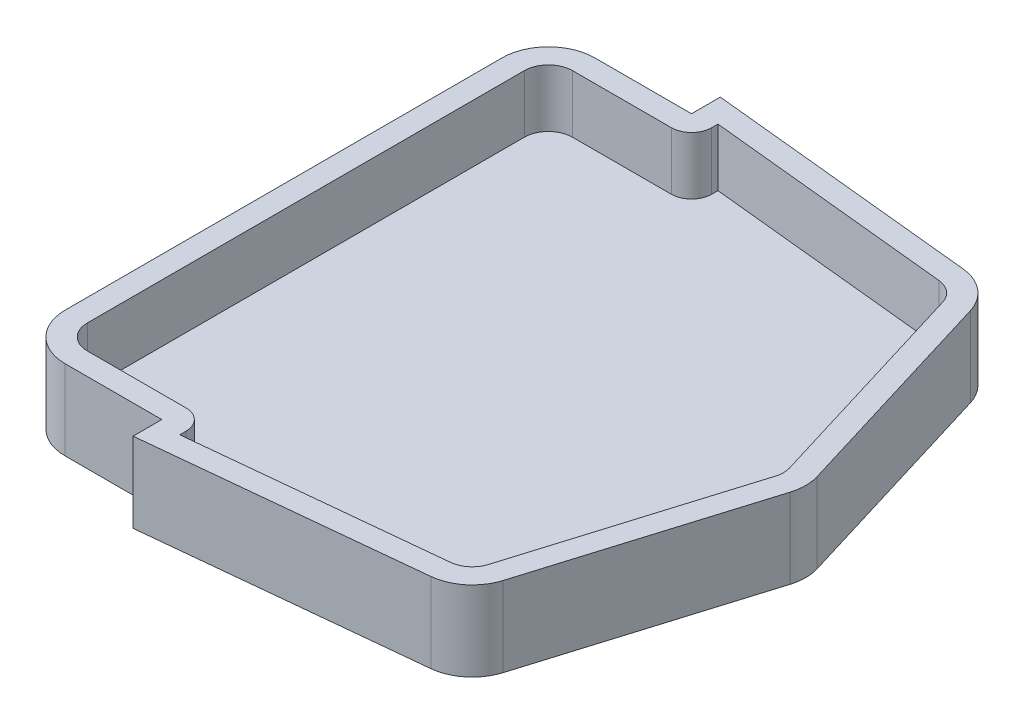
ISO-10303-21;
HEADER;
FILE_DESCRIPTION(('STEP AP214'),'2;1');
FILE_NAME('part.step','',(''),(''),'','','');
FILE_SCHEMA(('AUTOMOTIVE_DESIGN { 1 0 10303 214 1 1 1 1 }'));
ENDSEC;
DATA;
#1=APPLICATION_CONTEXT('core data for automotive mechanical design processes');
#2=APPLICATION_PROTOCOL_DEFINITION('international standard','automotive_design',2000,#1);
#3=PRODUCT_CONTEXT('',#1,'mechanical');
#4=PRODUCT('Part','Part','',(#3));
#5=PRODUCT_RELATED_PRODUCT_CATEGORY('part','',(#4));
#6=PRODUCT_DEFINITION_FORMATION('','',#4);
#7=PRODUCT_DEFINITION_CONTEXT('part definition',#1,'design');
#8=PRODUCT_DEFINITION('design','',#6,#7);
#9=PRODUCT_DEFINITION_SHAPE('','',#8);
#10=(LENGTH_UNIT() NAMED_UNIT(*) SI_UNIT(.MILLI.,.METRE.));
#11=(NAMED_UNIT(*) PLANE_ANGLE_UNIT() SI_UNIT($,.RADIAN.));
#12=(NAMED_UNIT(*) SI_UNIT($,.STERADIAN.) SOLID_ANGLE_UNIT());
#13=UNCERTAINTY_MEASURE_WITH_UNIT(LENGTH_MEASURE(1.E-05),#10,'distance_accuracy_value','');
#14=(GEOMETRIC_REPRESENTATION_CONTEXT(3) GLOBAL_UNCERTAINTY_ASSIGNED_CONTEXT((#13)) GLOBAL_UNIT_ASSIGNED_CONTEXT((#10,
#11,#12)) REPRESENTATION_CONTEXT('',''));
#15=CARTESIAN_POINT('',(0.,0.,0.));
#16=DIRECTION('',(0.,0.,1.));
#17=DIRECTION('',(1.,0.,0.));
#18=AXIS2_PLACEMENT_3D('',#15,#16,#17);
#19=CARTESIAN_POINT('',(-20.28,-2.2,0.));
#20=DIRECTION('',(1.,0.,0.));
#21=DIRECTION('',(0.,0.,-1.));
#22=AXIS2_PLACEMENT_3D('',#19,#20,#21);
#23=PLANE('',#22);
#24=DIRECTION('',(0.,1.,0.));
#25=VECTOR('',#24,1.);
#26=CARTESIAN_POINT('',(-20.28,-2.2,19.7));
#27=LINE('',#26,#25);
#28=CARTESIAN_POINT('',(-20.28,-4.2,19.7));
#29=VERTEX_POINT('',#28);
#30=CARTESIAN_POINT('',(-20.28,3.,19.7));
#31=VERTEX_POINT('',#30);
#32=EDGE_CURVE('E63',#29,#31,#27,.T.);
#33=ORIENTED_EDGE('',*,*,#32,.T.);
#34=DIRECTION('',(0.,0.,-1.));
#35=VECTOR('',#34,1.);
#36=CARTESIAN_POINT('',(-20.28,3.,0.));
#37=LINE('',#36,#35);
#38=CARTESIAN_POINT('',(-20.28,3.,-19.7));
#39=VERTEX_POINT('',#38);
#40=EDGE_CURVE('E337',#31,#39,#37,.T.);
#41=ORIENTED_EDGE('',*,*,#40,.T.);
#42=DIRECTION('',(0.,1.,0.));
#43=VECTOR('',#42,1.);
#44=CARTESIAN_POINT('',(-20.28,-2.2,-19.7));
#45=LINE('',#44,#43);
#46=CARTESIAN_POINT('',(-20.28,-4.2,-19.7));
#47=VERTEX_POINT('',#46);
#48=EDGE_CURVE('E11',#47,#39,#45,.T.);
#49=ORIENTED_EDGE('',*,*,#48,.F.);
#50=DIRECTION('',(0.,0.,-1.));
#51=VECTOR('',#50,1.);
#52=CARTESIAN_POINT('',(-20.28,-4.2,19.7));
#53=LINE('',#52,#51);
#54=EDGE_CURVE('E245',#29,#47,#53,.T.);
#55=ORIENTED_EDGE('',*,*,#54,.F.);
#56=EDGE_LOOP('',(#33,#41,#49,#55));
#57=FACE_BOUND('',#56,.T.);
#58=ADVANCED_FACE('F38',(#57),#23,.F.);
#59=CARTESIAN_POINT('',(-16.1,-2.2,-19.7));
#60=DIRECTION('',(0.,1.,0.));
#61=DIRECTION('',(0.,0.,1.));
#62=AXIS2_PLACEMENT_3D('',#59,#60,#61);
#63=CYLINDRICAL_SURFACE('',#62,4.18);
#64=ORIENTED_EDGE('',*,*,#48,.T.);
#65=CARTESIAN_POINT('',(-16.1,3.,-19.7));
#66=DIRECTION('',(0.,-1.,0.));
#67=DIRECTION('',(0.,0.,-1.));
#68=AXIS2_PLACEMENT_3D('',#65,#66,#67);
#69=CIRCLE('',#68,4.18);
#70=CARTESIAN_POINT('',(-16.1,3.,-23.88));
#71=VERTEX_POINT('',#70);
#72=EDGE_CURVE('E339',#39,#71,#69,.T.);
#73=ORIENTED_EDGE('',*,*,#72,.T.);
#74=DIRECTION('',(0.,1.,0.));
#75=VECTOR('',#74,1.);
#76=CARTESIAN_POINT('',(-16.1,-2.2,-23.88));
#77=LINE('',#76,#75);
#78=CARTESIAN_POINT('',(-16.1,-4.2,-23.88));
#79=VERTEX_POINT('',#78);
#80=EDGE_CURVE('E47',#79,#71,#77,.T.);
#81=ORIENTED_EDGE('',*,*,#80,.F.);
#82=CARTESIAN_POINT('',(-16.1,-4.2,-19.7));
#83=DIRECTION('',(0.,-1.,0.));
#84=DIRECTION('',(0.,0.,-1.));
#85=AXIS2_PLACEMENT_3D('',#82,#83,#84);
#86=CIRCLE('',#85,4.18);
#87=EDGE_CURVE('E249',#47,#79,#86,.T.);
#88=ORIENTED_EDGE('',*,*,#87,.F.);
#89=EDGE_LOOP('',(#64,#73,#81,#88));
#90=FACE_BOUND('',#89,.T.);
#91=ADVANCED_FACE('F548',(#90),#63,.T.);
#92=CARTESIAN_POINT('',(0.,-2.2,-23.88));
#93=DIRECTION('',(0.,0.,1.));
#94=DIRECTION('',(1.,0.,0.));
#95=AXIS2_PLACEMENT_3D('',#92,#93,#94);
#96=PLANE('',#95);
#97=ORIENTED_EDGE('',*,*,#80,.T.);
#98=DIRECTION('',(1.,0.,0.));
#99=VECTOR('',#98,1.);
#100=CARTESIAN_POINT('',(0.,3.,-23.88));
#101=LINE('',#100,#99);
#102=CARTESIAN_POINT('',(-7.38,3.,-23.88));
#103=VERTEX_POINT('',#102);
#104=EDGE_CURVE('E342',#71,#103,#101,.T.);
#105=ORIENTED_EDGE('',*,*,#104,.T.);
#106=DIRECTION('',(0.,1.,0.));
#107=VECTOR('',#106,1.);
#108=CARTESIAN_POINT('',(-7.38,-2.2,-23.88));
#109=LINE('',#108,#107);
#110=CARTESIAN_POINT('',(-7.38,-4.2,-23.88));
#111=VERTEX_POINT('',#110);
#112=EDGE_CURVE('E440',#111,#103,#109,.T.);
#113=ORIENTED_EDGE('',*,*,#112,.F.);
#114=DIRECTION('',(1.,0.,0.));
#115=VECTOR('',#114,1.);
#116=CARTESIAN_POINT('',(-16.1,-4.2,-23.88));
#117=LINE('',#116,#115);
#118=EDGE_CURVE('E259',#79,#111,#117,.T.);
#119=ORIENTED_EDGE('',*,*,#118,.F.);
#120=EDGE_LOOP('',(#97,#105,#113,#119));
#121=FACE_BOUND('',#120,.T.);
#122=ADVANCED_FACE('F555',(#121),#96,.F.);
#123=CARTESIAN_POINT('',(-7.38,-2.2,0.));
#124=DIRECTION('',(1.,0.,0.));
#125=DIRECTION('',(0.,0.,-1.));
#126=AXIS2_PLACEMENT_3D('',#123,#124,#125);
#127=PLANE('',#126);
#128=ORIENTED_EDGE('',*,*,#112,.T.);
#129=DIRECTION('',(0.,0.,-1.));
#130=VECTOR('',#129,1.);
#131=CARTESIAN_POINT('',(-7.38,3.,0.));
#132=LINE('',#131,#130);
#133=CARTESIAN_POINT('',(-7.38,3.,-26.4744016789471));
#134=VERTEX_POINT('',#133);
#135=EDGE_CURVE('E345',#103,#134,#132,.T.);
#136=ORIENTED_EDGE('',*,*,#135,.T.);
#137=DIRECTION('',(0.,1.,0.));
#138=VECTOR('',#137,1.);
#139=CARTESIAN_POINT('',(-7.38,-2.2,-26.4744016789471));
#140=LINE('',#139,#138);
#141=CARTESIAN_POINT('',(-7.38,-4.2,-26.4744016789471));
#142=VERTEX_POINT('',#141);
#143=EDGE_CURVE('E438',#142,#134,#140,.T.);
#144=ORIENTED_EDGE('',*,*,#143,.F.);
#145=DIRECTION('',(0.,0.,-1.));
#146=VECTOR('',#145,1.);
#147=CARTESIAN_POINT('',(-7.38,-4.2,-23.88));
#148=LINE('',#147,#146);
#149=EDGE_CURVE('E262',#111,#142,#148,.T.);
#150=ORIENTED_EDGE('',*,*,#149,.F.);
#151=EDGE_LOOP('',(#128,#136,#144,#150));
#152=FACE_BOUND('',#151,.T.);
#153=ADVANCED_FACE('F636',(#152),#127,.F.);
#154=CARTESIAN_POINT('',(2.58165178947084,-2.2,-25.4644642248835));
#155=DIRECTION('',(-0.100865485691314,0.,0.994900072266685));
#156=DIRECTION('',(0.994900072266685,0.,0.100865485691314));
#157=AXIS2_PLACEMENT_3D('',#154,#155,#156);
#158=PLANE('',#157);
#159=ORIENTED_EDGE('',*,*,#143,.T.);
#160=DIRECTION('',(0.994900072266685,0.,0.100865485691314));
#161=VECTOR('',#160,1.);
#162=CARTESIAN_POINT('',(2.58165178947084,3.,-25.4644642248835));
#163=LINE('',#162,#161);
#164=CARTESIAN_POINT('',(16.9959519590122,3.,-24.0031060161252));
#165=VERTEX_POINT('',#164);
#166=EDGE_CURVE('E348',#134,#165,#163,.T.);
#167=ORIENTED_EDGE('',*,*,#166,.T.);
#168=DIRECTION('',(0.,1.,0.));
#169=VECTOR('',#168,1.);
#170=CARTESIAN_POINT('',(16.9959519590122,-2.2,-24.0031060161252));
#171=LINE('',#170,#169);
#172=CARTESIAN_POINT('',(16.9959519590122,-4.2,-24.0031060161252));
#173=VERTEX_POINT('',#172);
#174=EDGE_CURVE('E436',#173,#165,#171,.T.);
#175=ORIENTED_EDGE('',*,*,#174,.F.);
#176=DIRECTION('',(0.994900072266685,0.,0.100865485691314));
#177=VECTOR('',#176,1.);
#178=CARTESIAN_POINT('',(-7.38,-4.2,-26.4744016789471));
#179=LINE('',#178,#177);
#180=EDGE_CURVE('E265',#142,#173,#179,.T.);
#181=ORIENTED_EDGE('',*,*,#180,.F.);
#182=EDGE_LOOP('',(#159,#167,#175,#181));
#183=FACE_BOUND('',#182,.T.);
#184=ADVANCED_FACE('F632',(#183),#158,.F.);
#185=CARTESIAN_POINT('',(16.5743342288224,-2.2,-19.8444237140504));
#186=DIRECTION('',(0.,1.,0.));
#187=DIRECTION('',(0.,0.,1.));
#188=AXIS2_PLACEMENT_3D('',#185,#186,#187);
#189=CYLINDRICAL_SURFACE('',#188,4.18);
#190=ORIENTED_EDGE('',*,*,#174,.T.);
#191=CARTESIAN_POINT('',(16.5743342288224,3.,-19.8444237140504));
#192=DIRECTION('',(0.,-1.,0.));
#193=DIRECTION('',(0.,0.,-1.));
#194=AXIS2_PLACEMENT_3D('',#191,#192,#193);
#195=CIRCLE('',#194,4.18);
#196=CARTESIAN_POINT('',(20.5730821232284,3.,-21.0619684881692));
#197=VERTEX_POINT('',#196);
#198=EDGE_CURVE('E351',#165,#197,#195,.T.);
#199=ORIENTED_EDGE('',*,*,#198,.T.);
#200=DIRECTION('',(0.,1.,0.));
#201=VECTOR('',#200,1.);
#202=CARTESIAN_POINT('',(20.5730821232284,-2.2,-21.0619684881692));
#203=LINE('',#202,#201);
#204=CARTESIAN_POINT('',(20.5730821232284,-4.2,-21.0619684881692));
#205=VERTEX_POINT('',#204);
#206=EDGE_CURVE('E434',#205,#197,#203,.T.);
#207=ORIENTED_EDGE('',*,*,#206,.F.);
#208=CARTESIAN_POINT('',(16.5743342288224,-4.2,-19.8444237140504));
#209=DIRECTION('',(0.,-1.,0.));
#210=DIRECTION('',(0.,0.,-1.));
#211=AXIS2_PLACEMENT_3D('',#208,#209,#210);
#212=CIRCLE('',#211,4.18000000000001);
#213=EDGE_CURVE('E268',#173,#205,#212,.T.);
#214=ORIENTED_EDGE('',*,*,#213,.F.);
#215=EDGE_LOOP('',(#190,#199,#207,#214));
#216=FACE_BOUND('',#215,.T.);
#217=ADVANCED_FACE('F628',(#216),#189,.T.);
#218=CARTESIAN_POINT('',(24.6964766523071,-2.2,-7.51962036147032));
#219=DIRECTION('',(-0.956638252250232,0.,0.291278654095389));
#220=DIRECTION('',(0.291278654095389,0.,0.956638252250232));
#221=AXIS2_PLACEMENT_3D('',#218,#219,#220);
#222=PLANE('',#221);
#223=ORIENTED_EDGE('',*,*,#206,.T.);
#224=DIRECTION('',(0.291278654095389,0.,0.956638252250232));
#225=VECTOR('',#224,1.);
#226=CARTESIAN_POINT('',(24.6964766523071,3.,-7.51962036147032));
#227=LINE('',#226,#225);
#228=CARTESIAN_POINT('',(26.61534210722,3.,-1.21754477411871));
#229=VERTEX_POINT('',#228);
#230=EDGE_CURVE('E354',#197,#229,#227,.T.);
#231=ORIENTED_EDGE('',*,*,#230,.T.);
#232=DIRECTION('',(0.,1.,0.));
#233=VECTOR('',#232,1.);
#234=CARTESIAN_POINT('',(26.61534210722,-2.2,-1.21754477411871));
#235=LINE('',#234,#233);
#236=CARTESIAN_POINT('',(26.61534210722,-4.2,-1.21754477411871));
#237=VERTEX_POINT('',#236);
#238=EDGE_CURVE('E432',#237,#229,#235,.T.);
#239=ORIENTED_EDGE('',*,*,#238,.F.);
#240=DIRECTION('',(0.291278654095389,0.,0.956638252250232));
#241=VECTOR('',#240,1.);
#242=CARTESIAN_POINT('',(20.5730821232284,-4.2,-21.0619684881692));
#243=LINE('',#242,#241);
#244=EDGE_CURVE('E271',#205,#237,#243,.T.);
#245=ORIENTED_EDGE('',*,*,#244,.F.);
#246=EDGE_LOOP('',(#223,#231,#239,#245));
#247=FACE_BOUND('',#246,.T.);
#248=ADVANCED_FACE('F624',(#247),#222,.F.);
#249=CARTESIAN_POINT('',(22.616594212814,-2.2,0.));
#250=DIRECTION('',(0.,1.,0.));
#251=DIRECTION('',(0.,0.,1.));
#252=AXIS2_PLACEMENT_3D('',#249,#250,#251);
#253=CYLINDRICAL_SURFACE('',#252,4.18);
#254=ORIENTED_EDGE('',*,*,#238,.T.);
#255=CARTESIAN_POINT('',(22.616594212814,3.,0.));
#256=DIRECTION('',(0.,-1.,0.));
#257=DIRECTION('',(0.,0.,-1.));
#258=AXIS2_PLACEMENT_3D('',#255,#256,#257);
#259=CIRCLE('',#258,4.18);
#260=CARTESIAN_POINT('',(26.61534210722,3.,1.21754477411873));
#261=VERTEX_POINT('',#260);
#262=EDGE_CURVE('E357',#229,#261,#259,.T.);
#263=ORIENTED_EDGE('',*,*,#262,.T.);
#264=DIRECTION('',(0.,1.,0.));
#265=VECTOR('',#264,1.);
#266=CARTESIAN_POINT('',(26.61534210722,-2.2,1.21754477411873));
#267=LINE('',#266,#265);
#268=CARTESIAN_POINT('',(26.61534210722,-4.2,1.21754477411873));
#269=VERTEX_POINT('',#268);
#270=EDGE_CURVE('E430',#269,#261,#267,.T.);
#271=ORIENTED_EDGE('',*,*,#270,.F.);
#272=CARTESIAN_POINT('',(22.616594212814,-4.2,0.));
#273=DIRECTION('',(0.,-1.,0.));
#274=DIRECTION('',(0.,0.,-1.));
#275=AXIS2_PLACEMENT_3D('',#272,#273,#274);
#276=CIRCLE('',#275,4.17999999999999);
#277=EDGE_CURVE('E274',#237,#269,#276,.T.);
#278=ORIENTED_EDGE('',*,*,#277,.F.);
#279=EDGE_LOOP('',(#254,#263,#271,#278));
#280=FACE_BOUND('',#279,.T.);
#281=ADVANCED_FACE('F620',(#280),#253,.T.);
#282=CARTESIAN_POINT('',(24.6964766523072,-2.2,7.51962036147032));
#283=DIRECTION('',(-0.956638252250232,0.,-0.291278654095389));
#284=DIRECTION('',(-0.291278654095389,0.,0.956638252250232));
#285=AXIS2_PLACEMENT_3D('',#282,#283,#284);
#286=PLANE('',#285);
#287=ORIENTED_EDGE('',*,*,#270,.T.);
#288=DIRECTION('',(-0.291278654095389,0.,0.956638252250232));
#289=VECTOR('',#288,1.);
#290=CARTESIAN_POINT('',(24.6964766523072,3.,7.51962036147032));
#291=LINE('',#290,#289);
#292=CARTESIAN_POINT('',(20.5730821232284,3.,21.0619684881692));
#293=VERTEX_POINT('',#292);
#294=EDGE_CURVE('E360',#261,#293,#291,.T.);
#295=ORIENTED_EDGE('',*,*,#294,.T.);
#296=DIRECTION('',(0.,1.,0.));
#297=VECTOR('',#296,1.);
#298=CARTESIAN_POINT('',(20.5730821232284,-2.2,21.0619684881692));
#299=LINE('',#298,#297);
#300=CARTESIAN_POINT('',(20.5730821232284,-4.2,21.0619684881692));
#301=VERTEX_POINT('',#300);
#302=EDGE_CURVE('E428',#301,#293,#299,.T.);
#303=ORIENTED_EDGE('',*,*,#302,.F.);
#304=DIRECTION('',(-0.291278654095389,0.,0.956638252250232));
#305=VECTOR('',#304,1.);
#306=CARTESIAN_POINT('',(26.61534210722,-4.2,1.21754477411873));
#307=LINE('',#306,#305);
#308=EDGE_CURVE('E277',#269,#301,#307,.T.);
#309=ORIENTED_EDGE('',*,*,#308,.F.);
#310=EDGE_LOOP('',(#287,#295,#303,#309));
#311=FACE_BOUND('',#310,.T.);
#312=ADVANCED_FACE('F616',(#311),#286,.F.);
#313=CARTESIAN_POINT('',(16.5743342288225,-2.2,19.8444237140504));
#314=DIRECTION('',(0.,1.,0.));
#315=DIRECTION('',(0.,0.,1.));
#316=AXIS2_PLACEMENT_3D('',#313,#314,#315);
#317=CYLINDRICAL_SURFACE('',#316,4.18);
#318=ORIENTED_EDGE('',*,*,#302,.T.);
#319=CARTESIAN_POINT('',(16.5743342288225,3.,19.8444237140504));
#320=DIRECTION('',(0.,-1.,0.));
#321=DIRECTION('',(0.,0.,-1.));
#322=AXIS2_PLACEMENT_3D('',#319,#320,#321);
#323=CIRCLE('',#322,4.18);
#324=CARTESIAN_POINT('',(16.9959519590121,3.,24.0031060161252));
#325=VERTEX_POINT('',#324);
#326=EDGE_CURVE('E363',#293,#325,#323,.T.);
#327=ORIENTED_EDGE('',*,*,#326,.T.);
#328=DIRECTION('',(0.,1.,0.));
#329=VECTOR('',#328,1.);
#330=CARTESIAN_POINT('',(16.9959519590121,-2.2,24.0031060161252));
#331=LINE('',#330,#329);
#332=CARTESIAN_POINT('',(16.9959519590121,-4.2,24.0031060161252));
#333=VERTEX_POINT('',#332);
#334=EDGE_CURVE('E426',#333,#325,#331,.T.);
#335=ORIENTED_EDGE('',*,*,#334,.F.);
#336=CARTESIAN_POINT('',(16.5743342288225,-4.2,19.8444237140504));
#337=DIRECTION('',(0.,-1.,0.));
#338=DIRECTION('',(0.,0.,-1.));
#339=AXIS2_PLACEMENT_3D('',#336,#337,#338);
#340=CIRCLE('',#339,4.18);
#341=EDGE_CURVE('E280',#301,#333,#340,.T.);
#342=ORIENTED_EDGE('',*,*,#341,.F.);
#343=EDGE_LOOP('',(#318,#327,#335,#342));
#344=FACE_BOUND('',#343,.T.);
#345=ADVANCED_FACE('F612',(#344),#317,.T.);
#346=CARTESIAN_POINT('',(2.58165178947085,-2.2,25.4644642248835));
#347=DIRECTION('',(-0.100865485691314,0.,-0.994900072266685));
#348=DIRECTION('',(-0.994900072266685,0.,0.100865485691314));
#349=AXIS2_PLACEMENT_3D('',#346,#347,#348);
#350=PLANE('',#349);
#351=ORIENTED_EDGE('',*,*,#334,.T.);
#352=DIRECTION('',(-0.994900072266685,0.,0.100865485691314));
#353=VECTOR('',#352,1.);
#354=CARTESIAN_POINT('',(2.58165178947085,3.,25.4644642248835));
#355=LINE('',#354,#353);
#356=CARTESIAN_POINT('',(-7.37999999999999,3.,26.4744016789471));
#357=VERTEX_POINT('',#356);
#358=EDGE_CURVE('E366',#325,#357,#355,.T.);
#359=ORIENTED_EDGE('',*,*,#358,.T.);
#360=DIRECTION('',(0.,1.,0.));
#361=VECTOR('',#360,1.);
#362=CARTESIAN_POINT('',(-7.37999999999999,-2.2,26.4744016789471));
#363=LINE('',#362,#361);
#364=CARTESIAN_POINT('',(-7.37999999999999,-4.2,26.4744016789471));
#365=VERTEX_POINT('',#364);
#366=EDGE_CURVE('E424',#365,#357,#363,.T.);
#367=ORIENTED_EDGE('',*,*,#366,.F.);
#368=DIRECTION('',(-0.994900072266685,0.,0.100865485691314));
#369=VECTOR('',#368,1.);
#370=CARTESIAN_POINT('',(16.9959519590121,-4.2,24.0031060161252));
#371=LINE('',#370,#369);
#372=EDGE_CURVE('E283',#333,#365,#371,.T.);
#373=ORIENTED_EDGE('',*,*,#372,.F.);
#374=EDGE_LOOP('',(#351,#359,#367,#373));
#375=FACE_BOUND('',#374,.T.);
#376=ADVANCED_FACE('F605',(#375),#350,.F.);
#377=CARTESIAN_POINT('',(-7.37999999999999,-2.2,0.));
#378=DIRECTION('',(1.,0.,0.));
#379=DIRECTION('',(0.,0.,-1.));
#380=AXIS2_PLACEMENT_3D('',#377,#378,#379);
#381=PLANE('',#380);
#382=ORIENTED_EDGE('',*,*,#366,.T.);
#383=DIRECTION('',(0.,0.,-1.));
#384=VECTOR('',#383,1.);
#385=CARTESIAN_POINT('',(-7.37999999999999,3.,0.));
#386=LINE('',#385,#384);
#387=CARTESIAN_POINT('',(-7.37999999999999,3.,23.88));
#388=VERTEX_POINT('',#387);
#389=EDGE_CURVE('E369',#357,#388,#386,.T.);
#390=ORIENTED_EDGE('',*,*,#389,.T.);
#391=DIRECTION('',(0.,1.,0.));
#392=VECTOR('',#391,1.);
#393=CARTESIAN_POINT('',(-7.37999999999999,-2.2,23.88));
#394=LINE('',#393,#392);
#395=CARTESIAN_POINT('',(-7.37999999999999,-4.2,23.88));
#396=VERTEX_POINT('',#395);
#397=EDGE_CURVE('E422',#396,#388,#394,.T.);
#398=ORIENTED_EDGE('',*,*,#397,.F.);
#399=DIRECTION('',(0.,0.,-1.));
#400=VECTOR('',#399,1.);
#401=CARTESIAN_POINT('',(-7.37999999999999,-4.2,26.4744016789471));
#402=LINE('',#401,#400);
#403=EDGE_CURVE('E286',#365,#396,#402,.T.);
#404=ORIENTED_EDGE('',*,*,#403,.F.);
#405=EDGE_LOOP('',(#382,#390,#398,#404));
#406=FACE_BOUND('',#405,.T.);
#407=ADVANCED_FACE('F598',(#406),#381,.F.);
#408=CARTESIAN_POINT('',(0.,-2.2,23.88));
#409=DIRECTION('',(0.,0.,-1.));
#410=DIRECTION('',(-1.,0.,0.));
#411=AXIS2_PLACEMENT_3D('',#408,#409,#410);
#412=PLANE('',#411);
#413=ORIENTED_EDGE('',*,*,#397,.T.);
#414=DIRECTION('',(-1.,0.,0.));
#415=VECTOR('',#414,1.);
#416=CARTESIAN_POINT('',(0.,3.,23.88));
#417=LINE('',#416,#415);
#418=CARTESIAN_POINT('',(-16.1,3.,23.88));
#419=VERTEX_POINT('',#418);
#420=EDGE_CURVE('E372',#388,#419,#417,.T.);
#421=ORIENTED_EDGE('',*,*,#420,.T.);
#422=DIRECTION('',(0.,1.,0.));
#423=VECTOR('',#422,1.);
#424=CARTESIAN_POINT('',(-16.1,-2.2,23.88));
#425=LINE('',#424,#423);
#426=CARTESIAN_POINT('',(-16.1,-4.2,23.88));
#427=VERTEX_POINT('',#426);
#428=EDGE_CURVE('E242',#427,#419,#425,.T.);
#429=ORIENTED_EDGE('',*,*,#428,.F.);
#430=DIRECTION('',(-1.,0.,0.));
#431=VECTOR('',#430,1.);
#432=CARTESIAN_POINT('',(-7.37999999999999,-4.2,23.88));
#433=LINE('',#432,#431);
#434=EDGE_CURVE('E255',#396,#427,#433,.T.);
#435=ORIENTED_EDGE('',*,*,#434,.F.);
#436=EDGE_LOOP('',(#413,#421,#429,#435));
#437=FACE_BOUND('',#436,.T.);
#438=ADVANCED_FACE('F592',(#437),#412,.F.);
#439=CARTESIAN_POINT('',(-7.2,-2.2,-23.7));
#440=DIRECTION('',(0.,1.,0.));
#441=DIRECTION('',(0.,0.,1.));
#442=AXIS2_PLACEMENT_3D('',#439,#440,#441);
#443=CYLINDRICAL_SURFACE('',#442,1.82);
#444=DIRECTION('',(0.,1.,0.));
#445=VECTOR('',#444,1.);
#446=CARTESIAN_POINT('',(-5.38,-2.2,-23.7));
#447=LINE('',#446,#445);
#448=CARTESIAN_POINT('',(-5.38,-2.2,-23.7));
#449=VERTEX_POINT('',#448);
#450=CARTESIAN_POINT('',(-5.38,3.,-23.7));
#451=VERTEX_POINT('',#450);
#452=EDGE_CURVE('E419',#449,#451,#447,.T.);
#453=ORIENTED_EDGE('',*,*,#452,.T.);
#454=CARTESIAN_POINT('',(-7.2,3.,-23.7));
#455=DIRECTION('',(0.,-1.,0.));
#456=DIRECTION('',(0.,0.,-1.));
#457=AXIS2_PLACEMENT_3D('',#454,#455,#456);
#458=CIRCLE('',#457,1.82);
#459=CARTESIAN_POINT('',(-7.19999999999999,3.,-21.88));
#460=VERTEX_POINT('',#459);
#461=EDGE_CURVE('E289',#451,#460,#458,.T.);
#462=ORIENTED_EDGE('',*,*,#461,.T.);
#463=DIRECTION('',(0.,1.,0.));
#464=VECTOR('',#463,1.);
#465=CARTESIAN_POINT('',(-7.19999999999999,-2.2,-21.88));
#466=LINE('',#465,#464);
#467=CARTESIAN_POINT('',(-7.19999999999999,-2.2,-21.88));
#468=VERTEX_POINT('',#467);
#469=EDGE_CURVE('E42',#468,#460,#466,.T.);
#470=ORIENTED_EDGE('',*,*,#469,.F.);
#471=CARTESIAN_POINT('',(-7.2,-2.2,-23.7));
#472=DIRECTION('',(0.,-1.,0.));
#473=DIRECTION('',(0.,0.,-1.));
#474=AXIS2_PLACEMENT_3D('',#471,#472,#473);
#475=CIRCLE('',#474,1.82);
#476=EDGE_CURVE('E376',#449,#468,#475,.T.);
#477=ORIENTED_EDGE('',*,*,#476,.F.);
#478=EDGE_LOOP('',(#453,#462,#470,#477));
#479=FACE_BOUND('',#478,.T.);
#480=ADVANCED_FACE('F40',(#479),#443,.T.);
#481=CARTESIAN_POINT('',(0.,-2.2,-21.88));
#482=DIRECTION('',(0.,0.,1.));
#483=DIRECTION('',(1.,0.,0.));
#484=AXIS2_PLACEMENT_3D('',#481,#482,#483);
#485=PLANE('',#484);
#486=ORIENTED_EDGE('',*,*,#469,.T.);
#487=DIRECTION('',(1.,0.,0.));
#488=VECTOR('',#487,1.);
#489=CARTESIAN_POINT('',(0.,3.,-21.88));
#490=LINE('',#489,#488);
#491=CARTESIAN_POINT('',(-16.1,3.,-21.88));
#492=VERTEX_POINT('',#491);
#493=EDGE_CURVE('E292',#492,#460,#490,.T.);
#494=ORIENTED_EDGE('',*,*,#493,.F.);
#495=DIRECTION('',(0.,1.,0.));
#496=VECTOR('',#495,1.);
#497=CARTESIAN_POINT('',(-16.1,-2.2,-21.88));
#498=LINE('',#497,#496);
#499=CARTESIAN_POINT('',(-16.1,-2.2,-21.88));
#500=VERTEX_POINT('',#499);
#501=EDGE_CURVE('E469',#500,#492,#498,.T.);
#502=ORIENTED_EDGE('',*,*,#501,.F.);
#503=DIRECTION('',(1.,0.,0.));
#504=VECTOR('',#503,1.);
#505=CARTESIAN_POINT('',(0.,-2.2,-21.88));
#506=LINE('',#505,#504);
#507=EDGE_CURVE('E378',#500,#468,#506,.T.);
#508=ORIENTED_EDGE('',*,*,#507,.T.);
#509=EDGE_LOOP('',(#486,#494,#502,#508));
#510=FACE_BOUND('',#509,.T.);
#511=ADVANCED_FACE('F476',(#510),#485,.T.);
#512=CARTESIAN_POINT('',(-16.1,-2.2,-19.7));
#513=DIRECTION('',(0.,1.,0.));
#514=DIRECTION('',(0.,0.,1.));
#515=AXIS2_PLACEMENT_3D('',#512,#513,#514);
#516=CYLINDRICAL_SURFACE('',#515,2.18);
#517=ORIENTED_EDGE('',*,*,#501,.T.);
#518=CARTESIAN_POINT('',(-16.1,3.,-19.7));
#519=DIRECTION('',(0.,-1.,0.));
#520=DIRECTION('',(0.,0.,-1.));
#521=AXIS2_PLACEMENT_3D('',#518,#519,#520);
#522=CIRCLE('',#521,2.18);
#523=CARTESIAN_POINT('',(-18.28,3.,-19.7));
#524=VERTEX_POINT('',#523);
#525=EDGE_CURVE('E295',#524,#492,#522,.T.);
#526=ORIENTED_EDGE('',*,*,#525,.F.);
#527=DIRECTION('',(0.,1.,0.));
#528=VECTOR('',#527,1.);
#529=CARTESIAN_POINT('',(-18.28,-2.2,-19.7));
#530=LINE('',#529,#528);
#531=CARTESIAN_POINT('',(-18.28,-2.2,-19.7));
#532=VERTEX_POINT('',#531);
#533=EDGE_CURVE('E468',#532,#524,#530,.T.);
#534=ORIENTED_EDGE('',*,*,#533,.F.);
#535=CARTESIAN_POINT('',(-16.1,-2.2,-19.7));
#536=DIRECTION('',(0.,-1.,0.));
#537=DIRECTION('',(0.,0.,-1.));
#538=AXIS2_PLACEMENT_3D('',#535,#536,#537);
#539=CIRCLE('',#538,2.18);
#540=EDGE_CURVE('E381',#532,#500,#539,.T.);
#541=ORIENTED_EDGE('',*,*,#540,.T.);
#542=EDGE_LOOP('',(#517,#526,#534,#541));
#543=FACE_BOUND('',#542,.T.);
#544=ADVANCED_FACE('F536',(#543),#516,.F.);
#545=CARTESIAN_POINT('',(-18.28,-2.2,0.));
#546=DIRECTION('',(1.,0.,0.));
#547=DIRECTION('',(0.,0.,-1.));
#548=AXIS2_PLACEMENT_3D('',#545,#546,#547);
#549=PLANE('',#548);
#550=ORIENTED_EDGE('',*,*,#533,.T.);
#551=DIRECTION('',(0.,0.,-1.));
#552=VECTOR('',#551,1.);
#553=CARTESIAN_POINT('',(-18.28,3.,0.));
#554=LINE('',#553,#552);
#555=CARTESIAN_POINT('',(-18.28,3.,19.7));
#556=VERTEX_POINT('',#555);
#557=EDGE_CURVE('E298',#556,#524,#554,.T.);
#558=ORIENTED_EDGE('',*,*,#557,.F.);
#559=DIRECTION('',(0.,1.,0.));
#560=VECTOR('',#559,1.);
#561=CARTESIAN_POINT('',(-18.28,-2.2,19.7));
#562=LINE('',#561,#560);
#563=CARTESIAN_POINT('',(-18.28,-2.2,19.7));
#564=VERTEX_POINT('',#563);
#565=EDGE_CURVE('E466',#564,#556,#562,.T.);
#566=ORIENTED_EDGE('',*,*,#565,.F.);
#567=DIRECTION('',(0.,0.,-1.));
#568=VECTOR('',#567,1.);
#569=CARTESIAN_POINT('',(-18.28,-2.2,0.));
#570=LINE('',#569,#568);
#571=EDGE_CURVE('E384',#564,#532,#570,.T.);
#572=ORIENTED_EDGE('',*,*,#571,.T.);
#573=EDGE_LOOP('',(#550,#558,#566,#572));
#574=FACE_BOUND('',#573,.T.);
#575=ADVANCED_FACE('F534',(#574),#549,.T.);
#576=CARTESIAN_POINT('',(-16.1,-2.2,19.7));
#577=DIRECTION('',(0.,1.,0.));
#578=DIRECTION('',(0.,0.,1.));
#579=AXIS2_PLACEMENT_3D('',#576,#577,#578);
#580=CYLINDRICAL_SURFACE('',#579,2.18);
#581=ORIENTED_EDGE('',*,*,#565,.T.);
#582=CARTESIAN_POINT('',(-16.1,3.,19.7));
#583=DIRECTION('',(0.,-1.,0.));
#584=DIRECTION('',(0.,0.,-1.));
#585=AXIS2_PLACEMENT_3D('',#582,#583,#584);
#586=CIRCLE('',#585,2.18);
#587=CARTESIAN_POINT('',(-16.1,3.,21.88));
#588=VERTEX_POINT('',#587);
#589=EDGE_CURVE('E301',#588,#556,#586,.T.);
#590=ORIENTED_EDGE('',*,*,#589,.F.);
#591=DIRECTION('',(0.,1.,0.));
#592=VECTOR('',#591,1.);
#593=CARTESIAN_POINT('',(-16.1,-2.2,21.88));
#594=LINE('',#593,#592);
#595=CARTESIAN_POINT('',(-16.1,-2.2,21.88));
#596=VERTEX_POINT('',#595);
#597=EDGE_CURVE('E464',#596,#588,#594,.T.);
#598=ORIENTED_EDGE('',*,*,#597,.F.);
#599=CARTESIAN_POINT('',(-16.1,-2.2,19.7));
#600=DIRECTION('',(0.,-1.,0.));
#601=DIRECTION('',(0.,0.,-1.));
#602=AXIS2_PLACEMENT_3D('',#599,#600,#601);
#603=CIRCLE('',#602,2.18);
#604=EDGE_CURVE('E387',#596,#564,#603,.T.);
#605=ORIENTED_EDGE('',*,*,#604,.T.);
#606=EDGE_LOOP('',(#581,#590,#598,#605));
#607=FACE_BOUND('',#606,.T.);
#608=ADVANCED_FACE('F531',(#607),#580,.F.);
#609=CARTESIAN_POINT('',(0.,-2.2,21.88));
#610=DIRECTION('',(0.,0.,-1.));
#611=DIRECTION('',(-1.,0.,0.));
#612=AXIS2_PLACEMENT_3D('',#609,#610,#611);
#613=PLANE('',#612);
#614=ORIENTED_EDGE('',*,*,#597,.T.);
#615=DIRECTION('',(-1.,0.,0.));
#616=VECTOR('',#615,1.);
#617=CARTESIAN_POINT('',(0.,3.,21.88));
#618=LINE('',#617,#616);
#619=CARTESIAN_POINT('',(-7.19999999999999,3.,21.88));
#620=VERTEX_POINT('',#619);
#621=EDGE_CURVE('E304',#620,#588,#618,.T.);
#622=ORIENTED_EDGE('',*,*,#621,.F.);
#623=DIRECTION('',(0.,1.,0.));
#624=VECTOR('',#623,1.);
#625=CARTESIAN_POINT('',(-7.19999999999999,-2.2,21.88));
#626=LINE('',#625,#624);
#627=CARTESIAN_POINT('',(-7.19999999999999,-2.2,21.88));
#628=VERTEX_POINT('',#627);
#629=EDGE_CURVE('E462',#628,#620,#626,.T.);
#630=ORIENTED_EDGE('',*,*,#629,.F.);
#631=DIRECTION('',(-1.,0.,0.));
#632=VECTOR('',#631,1.);
#633=CARTESIAN_POINT('',(0.,-2.2,21.88));
#634=LINE('',#633,#632);
#635=EDGE_CURVE('E390',#628,#596,#634,.T.);
#636=ORIENTED_EDGE('',*,*,#635,.T.);
#637=EDGE_LOOP('',(#614,#622,#630,#636));
#638=FACE_BOUND('',#637,.T.);
#639=ADVANCED_FACE('F526',(#638),#613,.T.);
#640=CARTESIAN_POINT('',(-7.19999999999999,-2.2,23.7));
#641=DIRECTION('',(0.,1.,0.));
#642=DIRECTION('',(0.,0.,1.));
#643=AXIS2_PLACEMENT_3D('',#640,#641,#642);
#644=CYLINDRICAL_SURFACE('',#643,1.82);
#645=ORIENTED_EDGE('',*,*,#629,.T.);
#646=CARTESIAN_POINT('',(-7.19999999999999,3.,23.7));
#647=DIRECTION('',(0.,-1.,0.));
#648=DIRECTION('',(0.,0.,-1.));
#649=AXIS2_PLACEMENT_3D('',#646,#647,#648);
#650=CIRCLE('',#649,1.82);
#651=CARTESIAN_POINT('',(-5.37999999999999,3.,23.7));
#652=VERTEX_POINT('',#651);
#653=EDGE_CURVE('E307',#620,#652,#650,.T.);
#654=ORIENTED_EDGE('',*,*,#653,.T.);
#655=DIRECTION('',(0.,1.,0.));
#656=VECTOR('',#655,1.);
#657=CARTESIAN_POINT('',(-5.37999999999999,-2.2,23.7));
#658=LINE('',#657,#656);
#659=CARTESIAN_POINT('',(-5.37999999999999,-2.2,23.7));
#660=VERTEX_POINT('',#659);
#661=EDGE_CURVE('E460',#660,#652,#658,.T.);
#662=ORIENTED_EDGE('',*,*,#661,.F.);
#663=CARTESIAN_POINT('',(-7.19999999999999,-2.2,23.7));
#664=DIRECTION('',(0.,-1.,0.));
#665=DIRECTION('',(0.,0.,-1.));
#666=AXIS2_PLACEMENT_3D('',#663,#664,#665);
#667=CIRCLE('',#666,1.82);
#668=EDGE_CURVE('E393',#628,#660,#667,.T.);
#669=ORIENTED_EDGE('',*,*,#668,.F.);
#670=EDGE_LOOP('',(#645,#654,#662,#669));
#671=FACE_BOUND('',#670,.T.);
#672=ADVANCED_FACE('F521',(#671),#644,.T.);
#673=CARTESIAN_POINT('',(-5.37999999999999,-2.2,0.));
#674=DIRECTION('',(1.,0.,0.));
#675=DIRECTION('',(0.,0.,-1.));
#676=AXIS2_PLACEMENT_3D('',#673,#674,#675);
#677=PLANE('',#676);
#678=ORIENTED_EDGE('',*,*,#661,.T.);
#679=DIRECTION('',(0.,0.,-1.));
#680=VECTOR('',#679,1.);
#681=CARTESIAN_POINT('',(-5.37999999999999,3.,0.));
#682=LINE('',#681,#680);
#683=CARTESIAN_POINT('',(-5.37999999999999,3.,24.2613844797761));
#684=VERTEX_POINT('',#683);
#685=EDGE_CURVE('E310',#684,#652,#682,.T.);
#686=ORIENTED_EDGE('',*,*,#685,.F.);
#687=DIRECTION('',(0.,1.,0.));
#688=VECTOR('',#687,1.);
#689=CARTESIAN_POINT('',(-5.37999999999999,-2.2,24.2613844797761));
#690=LINE('',#689,#688);
#691=CARTESIAN_POINT('',(-5.37999999999999,-2.2,24.2613844797761));
#692=VERTEX_POINT('',#691);
#693=EDGE_CURVE('E458',#692,#684,#690,.T.);
#694=ORIENTED_EDGE('',*,*,#693,.F.);
#695=DIRECTION('',(0.,0.,-1.));
#696=VECTOR('',#695,1.);
#697=CARTESIAN_POINT('',(-5.37999999999999,-2.2,0.));
#698=LINE('',#697,#696);
#699=EDGE_CURVE('E395',#692,#660,#698,.T.);
#700=ORIENTED_EDGE('',*,*,#699,.T.);
#701=EDGE_LOOP('',(#678,#686,#694,#700));
#702=FACE_BOUND('',#701,.T.);
#703=ADVANCED_FACE('F517',(#702),#677,.T.);
#704=CARTESIAN_POINT('',(2.37992081808822,-2.2,23.4746640803501));
#705=DIRECTION('',(-0.100865485691314,0.,-0.994900072266685));
#706=DIRECTION('',(-0.994900072266685,0.,0.100865485691314));
#707=AXIS2_PLACEMENT_3D('',#704,#705,#706);
#708=PLANE('',#707);
#709=ORIENTED_EDGE('',*,*,#693,.T.);
#710=DIRECTION('',(-0.994900072266685,0.,0.100865485691314));
#711=VECTOR('',#710,1.);
#712=CARTESIAN_POINT('',(2.37992081808822,3.,23.4746640803501));
#713=LINE('',#712,#711);
#714=CARTESIAN_POINT('',(16.7942209876295,3.,22.0133058715918));
#715=VERTEX_POINT('',#714);
#716=EDGE_CURVE('E313',#715,#684,#713,.T.);
#717=ORIENTED_EDGE('',*,*,#716,.F.);
#718=DIRECTION('',(0.,1.,0.));
#719=VECTOR('',#718,1.);
#720=CARTESIAN_POINT('',(16.7942209876295,-2.2,22.0133058715918));
#721=LINE('',#720,#719);
#722=CARTESIAN_POINT('',(16.7942209876295,-2.2,22.0133058715918));
#723=VERTEX_POINT('',#722);
#724=EDGE_CURVE('E456',#723,#715,#721,.T.);
#725=ORIENTED_EDGE('',*,*,#724,.F.);
#726=DIRECTION('',(-0.994900072266685,0.,0.100865485691314));
#727=VECTOR('',#726,1.);
#728=CARTESIAN_POINT('',(2.37992081808822,-2.2,23.4746640803501));
#729=LINE('',#728,#727);
#730=EDGE_CURVE('E398',#723,#692,#729,.T.);
#731=ORIENTED_EDGE('',*,*,#730,.T.);
#732=EDGE_LOOP('',(#709,#717,#725,#731));
#733=FACE_BOUND('',#732,.T.);
#734=ADVANCED_FACE('F514',(#733),#708,.T.);
#735=CARTESIAN_POINT('',(16.5743342288225,-2.2,19.8444237140504));
#736=DIRECTION('',(0.,1.,0.));
#737=DIRECTION('',(0.,0.,1.));
#738=AXIS2_PLACEMENT_3D('',#735,#736,#737);
#739=CYLINDRICAL_SURFACE('',#738,2.18);
#740=ORIENTED_EDGE('',*,*,#724,.T.);
#741=CARTESIAN_POINT('',(16.5743342288225,3.,19.8444237140504));
#742=DIRECTION('',(0.,-1.,0.));
#743=DIRECTION('',(0.,0.,-1.));
#744=AXIS2_PLACEMENT_3D('',#741,#742,#743);
#745=CIRCLE('',#744,2.18);
#746=CARTESIAN_POINT('',(18.659805618728,3.,20.4794111799784));
#747=VERTEX_POINT('',#746);
#748=EDGE_CURVE('E316',#747,#715,#745,.T.);
#749=ORIENTED_EDGE('',*,*,#748,.F.);
#750=DIRECTION('',(0.,1.,0.));
#751=VECTOR('',#750,1.);
#752=CARTESIAN_POINT('',(18.659805618728,-2.2,20.4794111799784));
#753=LINE('',#752,#751);
#754=CARTESIAN_POINT('',(18.659805618728,-2.2,20.4794111799784));
#755=VERTEX_POINT('',#754);
#756=EDGE_CURVE('E454',#755,#747,#753,.T.);
#757=ORIENTED_EDGE('',*,*,#756,.F.);
#758=CARTESIAN_POINT('',(16.5743342288225,-2.2,19.8444237140504));
#759=DIRECTION('',(0.,-1.,0.));
#760=DIRECTION('',(0.,0.,-1.));
#761=AXIS2_PLACEMENT_3D('',#758,#759,#760);
#762=CIRCLE('',#761,2.18);
#763=EDGE_CURVE('E401',#755,#723,#762,.T.);
#764=ORIENTED_EDGE('',*,*,#763,.T.);
#765=EDGE_LOOP('',(#740,#749,#757,#764));
#766=FACE_BOUND('',#765,.T.);
#767=ADVANCED_FACE('F509',(#766),#739,.F.);
#768=CARTESIAN_POINT('',(22.7832001478067,-2.2,6.93706305327954));
#769=DIRECTION('',(-0.956638252250232,0.,-0.291278654095389));
#770=DIRECTION('',(-0.291278654095389,0.,0.956638252250232));
#771=AXIS2_PLACEMENT_3D('',#768,#769,#770);
#772=PLANE('',#771);
#773=ORIENTED_EDGE('',*,*,#756,.T.);
#774=DIRECTION('',(-0.291278654095389,0.,0.956638252250232));
#775=VECTOR('',#774,1.);
#776=CARTESIAN_POINT('',(22.7832001478067,3.,6.93706305327954));
#777=LINE('',#776,#775);
#778=CARTESIAN_POINT('',(24.7020656027195,3.,0.63498746592795));
#779=VERTEX_POINT('',#778);
#780=EDGE_CURVE('E319',#779,#747,#777,.T.);
#781=ORIENTED_EDGE('',*,*,#780,.F.);
#782=DIRECTION('',(0.,1.,0.));
#783=VECTOR('',#782,1.);
#784=CARTESIAN_POINT('',(24.7020656027195,-2.2,0.63498746592795));
#785=LINE('',#784,#783);
#786=CARTESIAN_POINT('',(24.7020656027195,-2.2,0.63498746592795));
#787=VERTEX_POINT('',#786);
#788=EDGE_CURVE('E452',#787,#779,#785,.T.);
#789=ORIENTED_EDGE('',*,*,#788,.F.);
#790=DIRECTION('',(-0.291278654095389,0.,0.956638252250232));
#791=VECTOR('',#790,1.);
#792=CARTESIAN_POINT('',(22.7832001478067,-2.2,6.93706305327954));
#793=LINE('',#792,#791);
#794=EDGE_CURVE('E404',#787,#755,#793,.T.);
#795=ORIENTED_EDGE('',*,*,#794,.T.);
#796=EDGE_LOOP('',(#773,#781,#789,#795));
#797=FACE_BOUND('',#796,.T.);
#798=ADVANCED_FACE('F506',(#797),#772,.T.);
#799=CARTESIAN_POINT('',(22.616594212814,-2.2,0.));
#800=DIRECTION('',(0.,1.,0.));
#801=DIRECTION('',(0.,0.,1.));
#802=AXIS2_PLACEMENT_3D('',#799,#800,#801);
#803=CYLINDRICAL_SURFACE('',#802,2.18);
#804=ORIENTED_EDGE('',*,*,#788,.T.);
#805=CARTESIAN_POINT('',(22.616594212814,3.,0.));
#806=DIRECTION('',(0.,-1.,0.));
#807=DIRECTION('',(0.,0.,-1.));
#808=AXIS2_PLACEMENT_3D('',#805,#806,#807);
#809=CIRCLE('',#808,2.18);
#810=CARTESIAN_POINT('',(24.7020656027195,3.,-0.63498746592794));
#811=VERTEX_POINT('',#810);
#812=EDGE_CURVE('E322',#811,#779,#809,.T.);
#813=ORIENTED_EDGE('',*,*,#812,.F.);
#814=DIRECTION('',(0.,1.,0.));
#815=VECTOR('',#814,1.);
#816=CARTESIAN_POINT('',(24.7020656027195,-2.2,-0.63498746592794));
#817=LINE('',#816,#815);
#818=CARTESIAN_POINT('',(24.7020656027195,-2.2,-0.63498746592794));
#819=VERTEX_POINT('',#818);
#820=EDGE_CURVE('E450',#819,#811,#817,.T.);
#821=ORIENTED_EDGE('',*,*,#820,.F.);
#822=CARTESIAN_POINT('',(22.616594212814,-2.2,0.));
#823=DIRECTION('',(0.,-1.,0.));
#824=DIRECTION('',(0.,0.,-1.));
#825=AXIS2_PLACEMENT_3D('',#822,#823,#824);
#826=CIRCLE('',#825,2.18);
#827=EDGE_CURVE('E407',#819,#787,#826,.T.);
#828=ORIENTED_EDGE('',*,*,#827,.T.);
#829=EDGE_LOOP('',(#804,#813,#821,#828));
#830=FACE_BOUND('',#829,.T.);
#831=ADVANCED_FACE('F501',(#830),#803,.F.);
#832=CARTESIAN_POINT('',(22.7832001478067,-2.2,-6.93706305327955));
#833=DIRECTION('',(-0.956638252250232,0.,0.291278654095389));
#834=DIRECTION('',(0.291278654095389,0.,0.956638252250232));
#835=AXIS2_PLACEMENT_3D('',#832,#833,#834);
#836=PLANE('',#835);
#837=ORIENTED_EDGE('',*,*,#820,.T.);
#838=DIRECTION('',(0.291278654095389,0.,0.956638252250232));
#839=VECTOR('',#838,1.);
#840=CARTESIAN_POINT('',(22.7832001478067,3.,-6.93706305327955));
#841=LINE('',#840,#839);
#842=CARTESIAN_POINT('',(18.6598056187279,3.,-20.4794111799784));
#843=VERTEX_POINT('',#842);
#844=EDGE_CURVE('E325',#843,#811,#841,.T.);
#845=ORIENTED_EDGE('',*,*,#844,.F.);
#846=DIRECTION('',(0.,1.,0.));
#847=VECTOR('',#846,1.);
#848=CARTESIAN_POINT('',(18.6598056187279,-2.2,-20.4794111799784));
#849=LINE('',#848,#847);
#850=CARTESIAN_POINT('',(18.6598056187279,-2.2,-20.4794111799784));
#851=VERTEX_POINT('',#850);
#852=EDGE_CURVE('E448',#851,#843,#849,.T.);
#853=ORIENTED_EDGE('',*,*,#852,.F.);
#854=DIRECTION('',(0.291278654095389,0.,0.956638252250232));
#855=VECTOR('',#854,1.);
#856=CARTESIAN_POINT('',(22.7832001478067,-2.2,-6.93706305327955));
#857=LINE('',#856,#855);
#858=EDGE_CURVE('E410',#851,#819,#857,.T.);
#859=ORIENTED_EDGE('',*,*,#858,.T.);
#860=EDGE_LOOP('',(#837,#845,#853,#859));
#861=FACE_BOUND('',#860,.T.);
#862=ADVANCED_FACE('F498',(#861),#836,.T.);
#863=CARTESIAN_POINT('',(16.5743342288224,-2.2,-19.8444237140504));
#864=DIRECTION('',(0.,1.,0.));
#865=DIRECTION('',(0.,0.,1.));
#866=AXIS2_PLACEMENT_3D('',#863,#864,#865);
#867=CYLINDRICAL_SURFACE('',#866,2.18);
#868=ORIENTED_EDGE('',*,*,#852,.T.);
#869=CARTESIAN_POINT('',(16.5743342288224,3.,-19.8444237140504));
#870=DIRECTION('',(0.,-1.,0.));
#871=DIRECTION('',(0.,0.,-1.));
#872=AXIS2_PLACEMENT_3D('',#869,#870,#871);
#873=CIRCLE('',#872,2.18);
#874=CARTESIAN_POINT('',(16.7942209876295,3.,-22.0133058715918));
#875=VERTEX_POINT('',#874);
#876=EDGE_CURVE('E328',#875,#843,#873,.T.);
#877=ORIENTED_EDGE('',*,*,#876,.F.);
#878=DIRECTION('',(0.,1.,0.));
#879=VECTOR('',#878,1.);
#880=CARTESIAN_POINT('',(16.7942209876295,-2.2,-22.0133058715918));
#881=LINE('',#880,#879);
#882=CARTESIAN_POINT('',(16.7942209876295,-2.2,-22.0133058715918));
#883=VERTEX_POINT('',#882);
#884=EDGE_CURVE('E446',#883,#875,#881,.T.);
#885=ORIENTED_EDGE('',*,*,#884,.F.);
#886=CARTESIAN_POINT('',(16.5743342288224,-2.2,-19.8444237140504));
#887=DIRECTION('',(0.,-1.,0.));
#888=DIRECTION('',(0.,0.,-1.));
#889=AXIS2_PLACEMENT_3D('',#886,#887,#888);
#890=CIRCLE('',#889,2.18);
#891=EDGE_CURVE('E413',#883,#851,#890,.T.);
#892=ORIENTED_EDGE('',*,*,#891,.T.);
#893=EDGE_LOOP('',(#868,#877,#885,#892));
#894=FACE_BOUND('',#893,.T.);
#895=ADVANCED_FACE('F493',(#894),#867,.F.);
#896=CARTESIAN_POINT('',(2.37992081808822,-2.2,-23.4746640803501));
#897=DIRECTION('',(-0.100865485691314,0.,0.994900072266685));
#898=DIRECTION('',(0.994900072266685,0.,0.100865485691314));
#899=AXIS2_PLACEMENT_3D('',#896,#897,#898);
#900=PLANE('',#899);
#901=ORIENTED_EDGE('',*,*,#884,.T.);
#902=DIRECTION('',(0.994900072266685,0.,0.100865485691314));
#903=VECTOR('',#902,1.);
#904=CARTESIAN_POINT('',(2.37992081808822,3.,-23.4746640803501));
#905=LINE('',#904,#903);
#906=CARTESIAN_POINT('',(-5.37999999999999,3.,-24.2613844797761));
#907=VERTEX_POINT('',#906);
#908=EDGE_CURVE('E331',#907,#875,#905,.T.);
#909=ORIENTED_EDGE('',*,*,#908,.F.);
#910=DIRECTION('',(0.,1.,0.));
#911=VECTOR('',#910,1.);
#912=CARTESIAN_POINT('',(-5.37999999999999,-2.2,-24.2613844797761));
#913=LINE('',#912,#911);
#914=CARTESIAN_POINT('',(-5.37999999999999,-2.2,-24.2613844797761));
#915=VERTEX_POINT('',#914);
#916=EDGE_CURVE('E444',#915,#907,#913,.T.);
#917=ORIENTED_EDGE('',*,*,#916,.F.);
#918=DIRECTION('',(0.994900072266685,0.,0.100865485691314));
#919=VECTOR('',#918,1.);
#920=CARTESIAN_POINT('',(2.37992081808822,-2.2,-23.4746640803501));
#921=LINE('',#920,#919);
#922=EDGE_CURVE('E55',#915,#883,#921,.T.);
#923=ORIENTED_EDGE('',*,*,#922,.T.);
#924=EDGE_LOOP('',(#901,#909,#917,#923));
#925=FACE_BOUND('',#924,.T.);
#926=ADVANCED_FACE('F490',(#925),#900,.T.);
#927=CARTESIAN_POINT('',(-5.38000000000003,-2.2,0.));
#928=DIRECTION('',(1.,0.,0.));
#929=DIRECTION('',(0.,0.,-1.));
#930=AXIS2_PLACEMENT_3D('',#927,#928,#929);
#931=PLANE('',#930);
#932=ORIENTED_EDGE('',*,*,#916,.T.);
#933=DIRECTION('',(0.,0.,-1.));
#934=VECTOR('',#933,1.);
#935=CARTESIAN_POINT('',(-5.38000000000003,3.,0.));
#936=LINE('',#935,#934);
#937=EDGE_CURVE('E334',#451,#907,#936,.T.);
#938=ORIENTED_EDGE('',*,*,#937,.F.);
#939=ORIENTED_EDGE('',*,*,#452,.F.);
#940=DIRECTION('',(0.,0.,-1.));
#941=VECTOR('',#940,1.);
#942=CARTESIAN_POINT('',(-5.38000000000003,-2.2,0.));
#943=LINE('',#942,#941);
#944=EDGE_CURVE('E417',#449,#915,#943,.T.);
#945=ORIENTED_EDGE('',*,*,#944,.T.);
#946=EDGE_LOOP('',(#932,#938,#939,#945));
#947=FACE_BOUND('',#946,.T.);
#948=ADVANCED_FACE('F486',(#947),#931,.T.);
#949=CARTESIAN_POINT('',(-16.1,-2.2,19.7));
#950=DIRECTION('',(0.,1.,0.));
#951=DIRECTION('',(0.,0.,1.));
#952=AXIS2_PLACEMENT_3D('',#949,#950,#951);
#953=CYLINDRICAL_SURFACE('',#952,4.18);
#954=ORIENTED_EDGE('',*,*,#428,.T.);
#955=CARTESIAN_POINT('',(-16.1,3.,19.7));
#956=DIRECTION('',(0.,-1.,0.));
#957=DIRECTION('',(0.,0.,-1.));
#958=AXIS2_PLACEMENT_3D('',#955,#956,#957);
#959=CIRCLE('',#958,4.18);
#960=EDGE_CURVE('E241',#419,#31,#959,.T.);
#961=ORIENTED_EDGE('',*,*,#960,.T.);
#962=ORIENTED_EDGE('',*,*,#32,.F.);
#963=CARTESIAN_POINT('',(-16.1,-4.2,19.7));
#964=DIRECTION('',(0.,-1.,0.));
#965=DIRECTION('',(0.,0.,-1.));
#966=AXIS2_PLACEMENT_3D('',#963,#964,#965);
#967=CIRCLE('',#966,4.18);
#968=EDGE_CURVE('E239',#427,#29,#967,.T.);
#969=ORIENTED_EDGE('',*,*,#968,.F.);
#970=EDGE_LOOP('',(#954,#961,#962,#969));
#971=FACE_BOUND('',#970,.T.);
#972=ADVANCED_FACE('F237',(#971),#953,.T.);
#973=CARTESIAN_POINT('',(0.,3.,0.));
#974=DIRECTION('',(0.,-1.,0.));
#975=DIRECTION('',(0.,0.,-1.));
#976=AXIS2_PLACEMENT_3D('',#973,#974,#975);
#977=PLANE('',#976);
#978=ORIENTED_EDGE('',*,*,#461,.F.);
#979=ORIENTED_EDGE('',*,*,#937,.T.);
#980=ORIENTED_EDGE('',*,*,#908,.T.);
#981=ORIENTED_EDGE('',*,*,#876,.T.);
#982=ORIENTED_EDGE('',*,*,#844,.T.);
#983=ORIENTED_EDGE('',*,*,#812,.T.);
#984=ORIENTED_EDGE('',*,*,#780,.T.);
#985=ORIENTED_EDGE('',*,*,#748,.T.);
#986=ORIENTED_EDGE('',*,*,#716,.T.);
#987=ORIENTED_EDGE('',*,*,#685,.T.);
#988=ORIENTED_EDGE('',*,*,#653,.F.);
#989=ORIENTED_EDGE('',*,*,#621,.T.);
#990=ORIENTED_EDGE('',*,*,#589,.T.);
#991=ORIENTED_EDGE('',*,*,#557,.T.);
#992=ORIENTED_EDGE('',*,*,#525,.T.);
#993=ORIENTED_EDGE('',*,*,#493,.T.);
#994=EDGE_LOOP('',(#978,#979,#980,#981,#982,#983,#984,#985,#986,#987,#988,#989,#990,#991,#992,#993));
#995=FACE_BOUND('',#994,.T.);
#996=ORIENTED_EDGE('',*,*,#40,.F.);
#997=ORIENTED_EDGE('',*,*,#960,.F.);
#998=ORIENTED_EDGE('',*,*,#420,.F.);
#999=ORIENTED_EDGE('',*,*,#389,.F.);
#1000=ORIENTED_EDGE('',*,*,#358,.F.);
#1001=ORIENTED_EDGE('',*,*,#326,.F.);
#1002=ORIENTED_EDGE('',*,*,#294,.F.);
#1003=ORIENTED_EDGE('',*,*,#262,.F.);
#1004=ORIENTED_EDGE('',*,*,#230,.F.);
#1005=ORIENTED_EDGE('',*,*,#198,.F.);
#1006=ORIENTED_EDGE('',*,*,#166,.F.);
#1007=ORIENTED_EDGE('',*,*,#135,.F.);
#1008=ORIENTED_EDGE('',*,*,#104,.F.);
#1009=ORIENTED_EDGE('',*,*,#72,.F.);
#1010=EDGE_LOOP('',(#996,#997,#998,#999,#1000,#1001,#1002,#1003,#1004,#1005,#1006,#1007,#1008,#1009));
#1011=FACE_BOUND('',#1010,.T.);
#1012=ADVANCED_FACE('F481',(#995,#1011),#977,.F.);
#1013=CARTESIAN_POINT('',(-16.1,-2.2,19.7));
#1014=DIRECTION('',(0.,-1.,0.));
#1015=DIRECTION('',(0.,0.,-1.));
#1016=AXIS2_PLACEMENT_3D('',#1013,#1014,#1015);
#1017=PLANE('',#1016);
#1018=ORIENTED_EDGE('',*,*,#944,.F.);
#1019=ORIENTED_EDGE('',*,*,#476,.T.);
#1020=ORIENTED_EDGE('',*,*,#507,.F.);
#1021=ORIENTED_EDGE('',*,*,#540,.F.);
#1022=ORIENTED_EDGE('',*,*,#571,.F.);
#1023=ORIENTED_EDGE('',*,*,#604,.F.);
#1024=ORIENTED_EDGE('',*,*,#635,.F.);
#1025=ORIENTED_EDGE('',*,*,#668,.T.);
#1026=ORIENTED_EDGE('',*,*,#699,.F.);
#1027=ORIENTED_EDGE('',*,*,#730,.F.);
#1028=ORIENTED_EDGE('',*,*,#763,.F.);
#1029=ORIENTED_EDGE('',*,*,#794,.F.);
#1030=ORIENTED_EDGE('',*,*,#827,.F.);
#1031=ORIENTED_EDGE('',*,*,#858,.F.);
#1032=ORIENTED_EDGE('',*,*,#891,.F.);
#1033=ORIENTED_EDGE('',*,*,#922,.F.);
#1034=EDGE_LOOP('',(#1018,#1019,#1020,#1021,#1022,#1023,#1024,#1025,#1026,#1027,#1028,#1029,
#1030,#1031,#1032,#1033));
#1035=FACE_BOUND('',#1034,.T.);
#1036=ADVANCED_FACE('F537',(#1035),#1017,.F.);
#1037=CARTESIAN_POINT('',(-16.1,-4.2,19.7));
#1038=DIRECTION('',(0.,-1.,0.));
#1039=DIRECTION('',(0.,0.,-1.));
#1040=AXIS2_PLACEMENT_3D('',#1037,#1038,#1039);
#1041=PLANE('',#1040);
#1042=ORIENTED_EDGE('',*,*,#968,.T.);
#1043=ORIENTED_EDGE('',*,*,#54,.T.);
#1044=ORIENTED_EDGE('',*,*,#87,.T.);
#1045=ORIENTED_EDGE('',*,*,#118,.T.);
#1046=ORIENTED_EDGE('',*,*,#149,.T.);
#1047=ORIENTED_EDGE('',*,*,#180,.T.);
#1048=ORIENTED_EDGE('',*,*,#213,.T.);
#1049=ORIENTED_EDGE('',*,*,#244,.T.);
#1050=ORIENTED_EDGE('',*,*,#277,.T.);
#1051=ORIENTED_EDGE('',*,*,#308,.T.);
#1052=ORIENTED_EDGE('',*,*,#341,.T.);
#1053=ORIENTED_EDGE('',*,*,#372,.T.);
#1054=ORIENTED_EDGE('',*,*,#403,.T.);
#1055=ORIENTED_EDGE('',*,*,#434,.T.);
#1056=EDGE_LOOP('',(#1042,#1043,#1044,#1045,#1046,#1047,#1048,#1049,#1050,#1051,#1052,#1053,
#1054,#1055));
#1057=FACE_BOUND('',#1056,.T.);
#1058=ADVANCED_FACE('F252',(#1057),#1041,.T.);
#1059=CLOSED_SHELL('',(#58,#91,#122,#153,#184,#217,#248,#281,#312,#345,#376,#407,#438,#480,#511,
#544,#575,#608,#639,#672,#703,#734,#767,#798,#831,#862,#895,#926,#948,#972,#1012,#1036,#1058));
#1060=MANIFOLD_SOLID_BREP('B2',#1059);
#1061=ADVANCED_BREP_SHAPE_REPRESENTATION('',(#18,#1060),#14);
#1062=SHAPE_DEFINITION_REPRESENTATION(#9,#1061);
ENDSEC;
END-ISO-10303-21;
